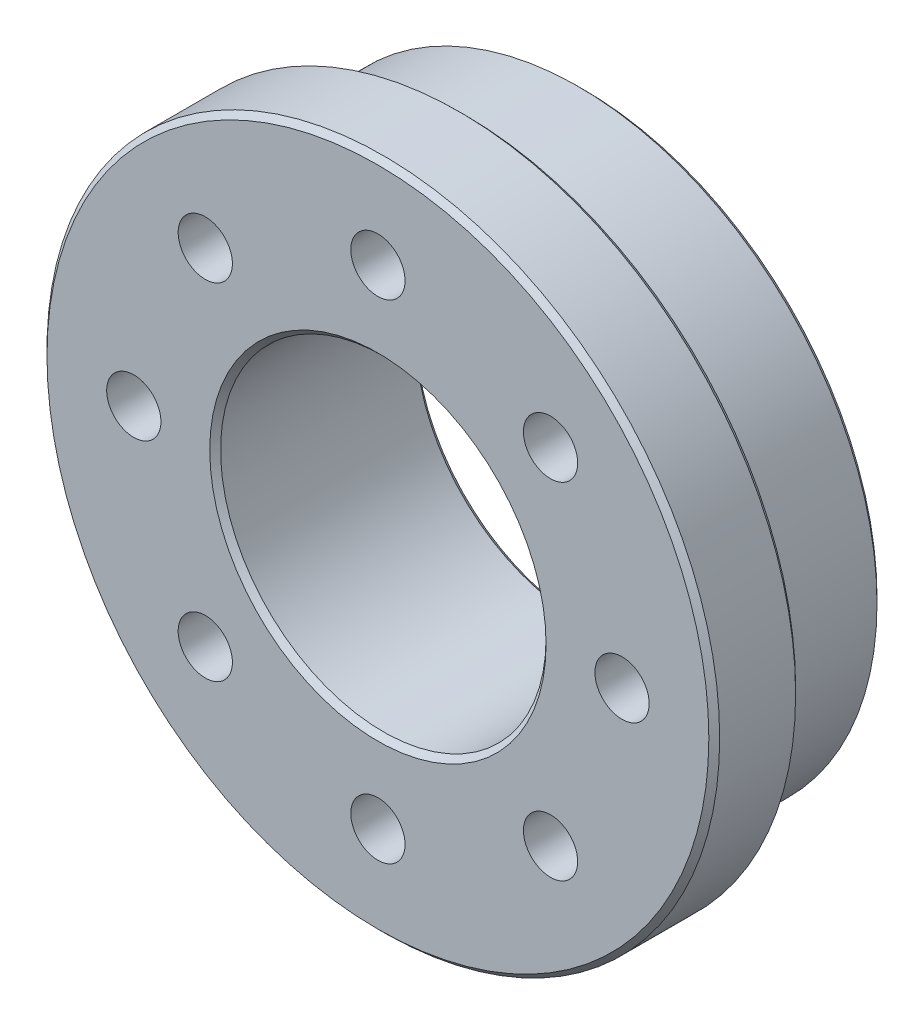
ISO-10303-21;
HEADER;
FILE_DESCRIPTION(('STEP AP214'),'2;1');
FILE_NAME('part.step','',(''),(''),'','','');
FILE_SCHEMA(('AUTOMOTIVE_DESIGN { 1 0 10303 214 1 1 1 1 }'));
ENDSEC;
DATA;
#1=APPLICATION_CONTEXT('core data for automotive mechanical design processes');
#2=APPLICATION_PROTOCOL_DEFINITION('international standard','automotive_design',2000,#1);
#3=PRODUCT_CONTEXT('',#1,'mechanical');
#4=PRODUCT('Part','Part','',(#3));
#5=PRODUCT_RELATED_PRODUCT_CATEGORY('part','',(#4));
#6=PRODUCT_DEFINITION_FORMATION('','',#4);
#7=PRODUCT_DEFINITION_CONTEXT('part definition',#1,'design');
#8=PRODUCT_DEFINITION('design','',#6,#7);
#9=PRODUCT_DEFINITION_SHAPE('','',#8);
#10=(LENGTH_UNIT() NAMED_UNIT(*) SI_UNIT(.MILLI.,.METRE.));
#11=(NAMED_UNIT(*) PLANE_ANGLE_UNIT() SI_UNIT($,.RADIAN.));
#12=(NAMED_UNIT(*) SI_UNIT($,.STERADIAN.) SOLID_ANGLE_UNIT());
#13=UNCERTAINTY_MEASURE_WITH_UNIT(LENGTH_MEASURE(1.E-05),#10,'distance_accuracy_value','');
#14=(GEOMETRIC_REPRESENTATION_CONTEXT(3) GLOBAL_UNCERTAINTY_ASSIGNED_CONTEXT((#13)) GLOBAL_UNIT_ASSIGNED_CONTEXT((#10,
#11,#12)) REPRESENTATION_CONTEXT('',''));
#15=CARTESIAN_POINT('',(0.,0.,0.));
#16=DIRECTION('',(0.,0.,1.));
#17=DIRECTION('',(1.,0.,0.));
#18=AXIS2_PLACEMENT_3D('',#15,#16,#17);
#19=CARTESIAN_POINT('',(0.,0.,11.));
#20=DIRECTION('',(0.,0.,-1.));
#21=DIRECTION('',(-1.,0.,0.));
#22=AXIS2_PLACEMENT_3D('',#19,#20,#21);
#23=CYLINDRICAL_SURFACE('',#22,27.5);
#24=CARTESIAN_POINT('',(0.,0.,0.500000000000004));
#25=DIRECTION('',(0.,0.,1.));
#26=DIRECTION('',(1.,0.,0.));
#27=AXIS2_PLACEMENT_3D('',#24,#25,#26);
#28=CIRCLE('',#27,27.5);
#29=CARTESIAN_POINT('',(27.5,0.,0.500000000000004));
#30=VERTEX_POINT('',#29);
#31=EDGE_CURVE('E39',#30,#30,#28,.T.);
#32=ORIENTED_EDGE('',*,*,#31,.T.);
#33=EDGE_LOOP('',(#32));
#34=FACE_BOUND('',#33,.T.);
#35=CARTESIAN_POINT('',(0.,0.,11.));
#36=DIRECTION('',(0.,0.,1.));
#37=DIRECTION('',(1.,0.,0.));
#38=AXIS2_PLACEMENT_3D('',#35,#36,#37);
#39=CIRCLE('',#38,27.5);
#40=CARTESIAN_POINT('',(27.5,0.,11.));
#41=VERTEX_POINT('',#40);
#42=EDGE_CURVE('E66',#41,#41,#39,.T.);
#43=ORIENTED_EDGE('',*,*,#42,.F.);
#44=EDGE_LOOP('',(#43));
#45=FACE_BOUND('',#44,.T.);
#46=ADVANCED_FACE('F28',(#34,#45),#23,.T.);
#47=CARTESIAN_POINT('',(0.,0.,0.));
#48=DIRECTION('',(0.,0.,1.));
#49=DIRECTION('',(1.,0.,0.));
#50=AXIS2_PLACEMENT_3D('',#47,#48,#49);
#51=PLANE('',#50);
#52=CARTESIAN_POINT('',(0.,0.,0.));
#53=DIRECTION('',(0.,0.,1.));
#54=DIRECTION('',(1.,0.,0.));
#55=AXIS2_PLACEMENT_3D('',#52,#53,#54);
#56=CIRCLE('',#55,15.5);
#57=CARTESIAN_POINT('',(15.5,0.,0.));
#58=VERTEX_POINT('',#57);
#59=EDGE_CURVE('E48',#58,#58,#56,.T.);
#60=ORIENTED_EDGE('',*,*,#59,.T.);
#61=EDGE_LOOP('',(#60));
#62=FACE_BOUND('',#61,.T.);
#63=CARTESIAN_POINT('',(0.,0.,0.));
#64=DIRECTION('',(0.,0.,1.));
#65=DIRECTION('',(1.,0.,0.));
#66=AXIS2_PLACEMENT_3D('',#63,#64,#65);
#67=CIRCLE('',#66,27.);
#68=CARTESIAN_POINT('',(27.,0.,0.));
#69=VERTEX_POINT('',#68);
#70=EDGE_CURVE('E51',#69,#69,#67,.F.);
#71=ORIENTED_EDGE('',*,*,#70,.T.);
#72=EDGE_LOOP('',(#71));
#73=FACE_BOUND('',#72,.T.);
#74=ADVANCED_FACE('F159',(#62,#73),#51,.F.);
#75=CARTESIAN_POINT('',(0.,0.,11.));
#76=DIRECTION('',(0.,0.,1.));
#77=DIRECTION('',(1.,0.,0.));
#78=AXIS2_PLACEMENT_3D('',#75,#76,#77);
#79=PLANE('',#78);
#80=CARTESIAN_POINT('',(0.,0.,11.));
#81=DIRECTION('',(0.,0.,1.));
#82=DIRECTION('',(1.,0.,0.));
#83=AXIS2_PLACEMENT_3D('',#80,#81,#82);
#84=CIRCLE('',#83,30.5);
#85=CARTESIAN_POINT('',(30.5,0.,11.));
#86=VERTEX_POINT('',#85);
#87=EDGE_CURVE('E54',#86,#86,#84,.F.);
#88=ORIENTED_EDGE('',*,*,#87,.T.);
#89=EDGE_LOOP('',(#88));
#90=FACE_BOUND('',#89,.T.);
#91=ORIENTED_EDGE('',*,*,#42,.T.);
#92=EDGE_LOOP('',(#91));
#93=FACE_BOUND('',#92,.T.);
#94=ADVANCED_FACE('F165',(#90,#93),#79,.F.);
#95=CARTESIAN_POINT('',(0.,0.,19.));
#96=DIRECTION('',(0.,0.,-1.));
#97=DIRECTION('',(-1.,0.,0.));
#98=AXIS2_PLACEMENT_3D('',#95,#96,#97);
#99=CYLINDRICAL_SURFACE('',#98,31.);
#100=CARTESIAN_POINT('',(0.,0.,18.5));
#101=DIRECTION('',(0.,0.,1.));
#102=DIRECTION('',(1.,0.,0.));
#103=AXIS2_PLACEMENT_3D('',#100,#101,#102);
#104=CIRCLE('',#103,31.);
#105=CARTESIAN_POINT('',(31.,0.,18.5));
#106=VERTEX_POINT('',#105);
#107=EDGE_CURVE('E57',#106,#106,#104,.F.);
#108=ORIENTED_EDGE('',*,*,#107,.T.);
#109=EDGE_LOOP('',(#108));
#110=FACE_BOUND('',#109,.T.);
#111=CARTESIAN_POINT('',(0.,0.,11.5));
#112=DIRECTION('',(0.,0.,1.));
#113=DIRECTION('',(1.,0.,0.));
#114=AXIS2_PLACEMENT_3D('',#111,#112,#113);
#115=CIRCLE('',#114,31.);
#116=CARTESIAN_POINT('',(31.,0.,11.5));
#117=VERTEX_POINT('',#116);
#118=EDGE_CURVE('E60',#117,#117,#115,.T.);
#119=ORIENTED_EDGE('',*,*,#118,.T.);
#120=EDGE_LOOP('',(#119));
#121=FACE_BOUND('',#120,.T.);
#122=ADVANCED_FACE('F131',(#110,#121),#99,.T.);
#123=CARTESIAN_POINT('',(0.,0.,19.));
#124=DIRECTION('',(0.,0.,1.));
#125=DIRECTION('',(1.,0.,0.));
#126=AXIS2_PLACEMENT_3D('',#123,#124,#125);
#127=PLANE('',#126);
#128=CARTESIAN_POINT('',(0.,0.,19.));
#129=DIRECTION('',(0.,0.,1.));
#130=DIRECTION('',(1.,0.,0.));
#131=AXIS2_PLACEMENT_3D('',#128,#129,#130);
#132=CIRCLE('',#131,15.5);
#133=CARTESIAN_POINT('',(15.5,0.,19.));
#134=VERTEX_POINT('',#133);
#135=EDGE_CURVE('E10',#134,#134,#132,.F.);
#136=ORIENTED_EDGE('',*,*,#135,.T.);
#137=EDGE_LOOP('',(#136));
#138=FACE_BOUND('',#137,.T.);
#139=CARTESIAN_POINT('',(0.,0.,19.));
#140=DIRECTION('',(0.,0.,1.));
#141=DIRECTION('',(1.,0.,0.));
#142=AXIS2_PLACEMENT_3D('',#139,#140,#141);
#143=CIRCLE('',#142,30.5);
#144=CARTESIAN_POINT('',(30.5,0.,19.));
#145=VERTEX_POINT('',#144);
#146=EDGE_CURVE('E63',#145,#145,#143,.T.);
#147=ORIENTED_EDGE('',*,*,#146,.T.);
#148=EDGE_LOOP('',(#147));
#149=FACE_BOUND('',#148,.T.);
#150=CARTESIAN_POINT('',(-15.9099025766972,15.9099025766971,19.));
#151=DIRECTION('',(0.,0.,1.));
#152=DIRECTION('',(1.,0.,0.));
#153=AXIS2_PLACEMENT_3D('',#150,#151,#152);
#154=CIRCLE('',#153,2.50000000000056);
#155=CARTESIAN_POINT('',(-13.4099025766967,15.9099025766971,19.));
#156=VERTEX_POINT('',#155);
#157=EDGE_CURVE('E112',#156,#156,#154,.T.);
#158=ORIENTED_EDGE('',*,*,#157,.F.);
#159=EDGE_LOOP('',(#158));
#160=FACE_BOUND('',#159,.T.);
#161=CARTESIAN_POINT('',(-22.4999999999997,-2.96889500051071E-13,19.));
#162=DIRECTION('',(0.,0.,1.));
#163=DIRECTION('',(1.,0.,0.));
#164=AXIS2_PLACEMENT_3D('',#161,#162,#163);
#165=CIRCLE('',#164,2.50000000000056);
#166=CARTESIAN_POINT('',(-19.9999999999992,-2.96889500051071E-13,19.));
#167=VERTEX_POINT('',#166);
#168=EDGE_CURVE('E106',#167,#167,#165,.T.);
#169=ORIENTED_EDGE('',*,*,#168,.F.);
#170=EDGE_LOOP('',(#169));
#171=FACE_BOUND('',#170,.T.);
#172=CARTESIAN_POINT('',(-15.9099025766968,-15.9099025766975,19.));
#173=DIRECTION('',(0.,0.,1.));
#174=DIRECTION('',(1.,0.,0.));
#175=AXIS2_PLACEMENT_3D('',#172,#173,#174);
#176=CIRCLE('',#175,2.50000000000056);
#177=CARTESIAN_POINT('',(-13.4099025766963,-15.9099025766975,19.));
#178=VERTEX_POINT('',#177);
#179=EDGE_CURVE('E100',#178,#178,#176,.T.);
#180=ORIENTED_EDGE('',*,*,#179,.F.);
#181=EDGE_LOOP('',(#180));
#182=FACE_BOUND('',#181,.T.);
#183=CARTESIAN_POINT('',(5.71144402693228E-13,-22.5,19.));
#184=DIRECTION('',(0.,0.,1.));
#185=DIRECTION('',(1.,0.,0.));
#186=AXIS2_PLACEMENT_3D('',#183,#184,#185);
#187=CIRCLE('',#186,2.50000000000056);
#188=CARTESIAN_POINT('',(2.50000000000113,-22.5,19.));
#189=VERTEX_POINT('',#188);
#190=EDGE_CURVE('E94',#189,#189,#187,.T.);
#191=ORIENTED_EDGE('',*,*,#190,.F.);
#192=EDGE_LOOP('',(#191));
#193=FACE_BOUND('',#192,.T.);
#194=CARTESIAN_POINT('',(15.9099025766978,-15.9099025766971,19.));
#195=DIRECTION('',(0.,0.,1.));
#196=DIRECTION('',(1.,0.,0.));
#197=AXIS2_PLACEMENT_3D('',#194,#195,#196);
#198=CIRCLE('',#197,2.50000000000051);
#199=CARTESIAN_POINT('',(18.4099025766983,-15.9099025766971,19.));
#200=VERTEX_POINT('',#199);
#201=EDGE_CURVE('E88',#200,#200,#198,.T.);
#202=ORIENTED_EDGE('',*,*,#201,.F.);
#203=EDGE_LOOP('',(#202));
#204=FACE_BOUND('',#203,.T.);
#205=CARTESIAN_POINT('',(22.5000000000003,2.86405073463184E-13,19.));
#206=DIRECTION('',(0.,0.,1.));
#207=DIRECTION('',(1.,0.,0.));
#208=AXIS2_PLACEMENT_3D('',#205,#206,#207);
#209=CIRCLE('',#208,2.50000000000056);
#210=CARTESIAN_POINT('',(25.0000000000008,2.86405073463184E-13,19.));
#211=VERTEX_POINT('',#210);
#212=EDGE_CURVE('E82',#211,#211,#209,.T.);
#213=ORIENTED_EDGE('',*,*,#212,.F.);
#214=EDGE_LOOP('',(#213));
#215=FACE_BOUND('',#214,.T.);
#216=CARTESIAN_POINT('',(15.9099025766974,15.9099025766975,19.));
#217=DIRECTION('',(0.,0.,1.));
#218=DIRECTION('',(1.,0.,0.));
#219=AXIS2_PLACEMENT_3D('',#216,#217,#218);
#220=CIRCLE('',#219,2.50000000000056);
#221=CARTESIAN_POINT('',(18.409902576698,15.9099025766975,19.));
#222=VERTEX_POINT('',#221);
#223=EDGE_CURVE('E76',#222,#222,#220,.T.);
#224=ORIENTED_EDGE('',*,*,#223,.F.);
#225=EDGE_LOOP('',(#224));
#226=FACE_BOUND('',#225,.T.);
#227=CARTESIAN_POINT('',(0.,22.5,19.));
#228=DIRECTION('',(0.,0.,1.));
#229=DIRECTION('',(1.,0.,0.));
#230=AXIS2_PLACEMENT_3D('',#227,#228,#229);
#231=CIRCLE('',#230,2.50000000000056);
#232=CARTESIAN_POINT('',(2.50000000000056,22.5,19.));
#233=VERTEX_POINT('',#232);
#234=EDGE_CURVE('E70',#233,#233,#231,.T.);
#235=ORIENTED_EDGE('',*,*,#234,.F.);
#236=EDGE_LOOP('',(#235));
#237=FACE_BOUND('',#236,.T.);
#238=ADVANCED_FACE('F127',(#138,#149,#160,#171,#182,#193,#204,#215,#226,#237),#127,.T.);
#239=CARTESIAN_POINT('',(0.,22.5,4.));
#240=DIRECTION('',(0.,0.,1.));
#241=DIRECTION('',(1.,0.,0.));
#242=AXIS2_PLACEMENT_3D('',#239,#240,#241);
#243=CYLINDRICAL_SURFACE('',#242,2.50000000000056);
#244=CARTESIAN_POINT('',(0.,22.5,4.));
#245=DIRECTION('',(0.,0.,1.));
#246=DIRECTION('',(1.,0.,0.));
#247=AXIS2_PLACEMENT_3D('',#244,#245,#246);
#248=CIRCLE('',#247,2.50000000000056);
#249=CARTESIAN_POINT('',(2.50000000000056,22.5,4.));
#250=VERTEX_POINT('',#249);
#251=EDGE_CURVE('E69',#250,#250,#248,.T.);
#252=ORIENTED_EDGE('',*,*,#251,.F.);
#253=EDGE_LOOP('',(#252));
#254=FACE_BOUND('',#253,.T.);
#255=ORIENTED_EDGE('',*,*,#234,.T.);
#256=EDGE_LOOP('',(#255));
#257=FACE_BOUND('',#256,.T.);
#258=ADVANCED_FACE('F130',(#254,#257),#243,.F.);
#259=CARTESIAN_POINT('',(0.,22.5,4.));
#260=DIRECTION('',(0.,0.,1.));
#261=DIRECTION('',(1.,0.,0.));
#262=AXIS2_PLACEMENT_3D('',#259,#260,#261);
#263=PLANE('',#262);
#264=ORIENTED_EDGE('',*,*,#251,.T.);
#265=EDGE_LOOP('',(#264));
#266=FACE_BOUND('',#265,.T.);
#267=ADVANCED_FACE('F148',(#266),#263,.T.);
#268=CARTESIAN_POINT('',(15.9099025766974,15.9099025766975,4.));
#269=DIRECTION('',(0.,0.,1.));
#270=DIRECTION('',(1.,0.,0.));
#271=AXIS2_PLACEMENT_3D('',#268,#269,#270);
#272=CYLINDRICAL_SURFACE('',#271,2.50000000000056);
#273=CARTESIAN_POINT('',(15.9099025766974,15.9099025766975,4.));
#274=DIRECTION('',(0.,0.,1.));
#275=DIRECTION('',(1.,0.,0.));
#276=AXIS2_PLACEMENT_3D('',#273,#274,#275);
#277=CIRCLE('',#276,2.50000000000056);
#278=CARTESIAN_POINT('',(18.409902576698,15.9099025766975,4.));
#279=VERTEX_POINT('',#278);
#280=EDGE_CURVE('E73',#279,#279,#277,.T.);
#281=ORIENTED_EDGE('',*,*,#280,.F.);
#282=EDGE_LOOP('',(#281));
#283=FACE_BOUND('',#282,.T.);
#284=ORIENTED_EDGE('',*,*,#223,.T.);
#285=EDGE_LOOP('',(#284));
#286=FACE_BOUND('',#285,.T.);
#287=ADVANCED_FACE('F154',(#283,#286),#272,.F.);
#288=CARTESIAN_POINT('',(15.9099025766974,15.9099025766975,4.));
#289=DIRECTION('',(0.,0.,1.));
#290=DIRECTION('',(1.,0.,0.));
#291=AXIS2_PLACEMENT_3D('',#288,#289,#290);
#292=PLANE('',#291);
#293=ORIENTED_EDGE('',*,*,#280,.T.);
#294=EDGE_LOOP('',(#293));
#295=FACE_BOUND('',#294,.T.);
#296=ADVANCED_FACE('F374',(#295),#292,.T.);
#297=CARTESIAN_POINT('',(22.5000000000003,2.86405073463184E-13,4.));
#298=DIRECTION('',(0.,0.,1.));
#299=DIRECTION('',(1.,0.,0.));
#300=AXIS2_PLACEMENT_3D('',#297,#298,#299);
#301=CYLINDRICAL_SURFACE('',#300,2.50000000000056);
#302=CARTESIAN_POINT('',(22.5000000000003,2.86405073463184E-13,4.));
#303=DIRECTION('',(0.,0.,1.));
#304=DIRECTION('',(1.,0.,0.));
#305=AXIS2_PLACEMENT_3D('',#302,#303,#304);
#306=CIRCLE('',#305,2.50000000000056);
#307=CARTESIAN_POINT('',(25.0000000000008,2.86405073463184E-13,4.));
#308=VERTEX_POINT('',#307);
#309=EDGE_CURVE('E79',#308,#308,#306,.T.);
#310=ORIENTED_EDGE('',*,*,#309,.F.);
#311=EDGE_LOOP('',(#310));
#312=FACE_BOUND('',#311,.T.);
#313=ORIENTED_EDGE('',*,*,#212,.T.);
#314=EDGE_LOOP('',(#313));
#315=FACE_BOUND('',#314,.T.);
#316=ADVANCED_FACE('F364',(#312,#315),#301,.F.);
#317=CARTESIAN_POINT('',(22.5000000000003,2.86405073463184E-13,4.));
#318=DIRECTION('',(0.,0.,1.));
#319=DIRECTION('',(1.,0.,0.));
#320=AXIS2_PLACEMENT_3D('',#317,#318,#319);
#321=PLANE('',#320);
#322=ORIENTED_EDGE('',*,*,#309,.T.);
#323=EDGE_LOOP('',(#322));
#324=FACE_BOUND('',#323,.T.);
#325=ADVANCED_FACE('F354',(#324),#321,.T.);
#326=CARTESIAN_POINT('',(15.9099025766978,-15.9099025766971,4.));
#327=DIRECTION('',(0.,0.,1.));
#328=DIRECTION('',(1.,0.,0.));
#329=AXIS2_PLACEMENT_3D('',#326,#327,#328);
#330=CYLINDRICAL_SURFACE('',#329,2.50000000000051);
#331=CARTESIAN_POINT('',(15.9099025766978,-15.9099025766971,4.));
#332=DIRECTION('',(0.,0.,1.));
#333=DIRECTION('',(1.,0.,0.));
#334=AXIS2_PLACEMENT_3D('',#331,#332,#333);
#335=CIRCLE('',#334,2.50000000000051);
#336=CARTESIAN_POINT('',(18.4099025766983,-15.9099025766971,4.));
#337=VERTEX_POINT('',#336);
#338=EDGE_CURVE('E85',#337,#337,#335,.T.);
#339=ORIENTED_EDGE('',*,*,#338,.F.);
#340=EDGE_LOOP('',(#339));
#341=FACE_BOUND('',#340,.T.);
#342=ORIENTED_EDGE('',*,*,#201,.T.);
#343=EDGE_LOOP('',(#342));
#344=FACE_BOUND('',#343,.T.);
#345=ADVANCED_FACE('F344',(#341,#344),#330,.F.);
#346=CARTESIAN_POINT('',(15.9099025766978,-15.9099025766971,4.));
#347=DIRECTION('',(0.,0.,1.));
#348=DIRECTION('',(1.,0.,0.));
#349=AXIS2_PLACEMENT_3D('',#346,#347,#348);
#350=PLANE('',#349);
#351=ORIENTED_EDGE('',*,*,#338,.T.);
#352=EDGE_LOOP('',(#351));
#353=FACE_BOUND('',#352,.T.);
#354=ADVANCED_FACE('F334',(#353),#350,.T.);
#355=CARTESIAN_POINT('',(5.71144402693228E-13,-22.5,4.));
#356=DIRECTION('',(0.,0.,1.));
#357=DIRECTION('',(1.,0.,0.));
#358=AXIS2_PLACEMENT_3D('',#355,#356,#357);
#359=CYLINDRICAL_SURFACE('',#358,2.50000000000056);
#360=CARTESIAN_POINT('',(5.71144402693228E-13,-22.5,4.));
#361=DIRECTION('',(0.,0.,1.));
#362=DIRECTION('',(1.,0.,0.));
#363=AXIS2_PLACEMENT_3D('',#360,#361,#362);
#364=CIRCLE('',#363,2.50000000000056);
#365=CARTESIAN_POINT('',(2.50000000000113,-22.5,4.));
#366=VERTEX_POINT('',#365);
#367=EDGE_CURVE('E91',#366,#366,#364,.T.);
#368=ORIENTED_EDGE('',*,*,#367,.F.);
#369=EDGE_LOOP('',(#368));
#370=FACE_BOUND('',#369,.T.);
#371=ORIENTED_EDGE('',*,*,#190,.T.);
#372=EDGE_LOOP('',(#371));
#373=FACE_BOUND('',#372,.T.);
#374=ADVANCED_FACE('F324',(#370,#373),#359,.F.);
#375=CARTESIAN_POINT('',(5.71144402693228E-13,-22.5,4.));
#376=DIRECTION('',(0.,0.,1.));
#377=DIRECTION('',(1.,0.,0.));
#378=AXIS2_PLACEMENT_3D('',#375,#376,#377);
#379=PLANE('',#378);
#380=ORIENTED_EDGE('',*,*,#367,.T.);
#381=EDGE_LOOP('',(#380));
#382=FACE_BOUND('',#381,.T.);
#383=ADVANCED_FACE('F314',(#382),#379,.T.);
#384=CARTESIAN_POINT('',(-15.9099025766968,-15.9099025766975,4.));
#385=DIRECTION('',(0.,0.,1.));
#386=DIRECTION('',(1.,0.,0.));
#387=AXIS2_PLACEMENT_3D('',#384,#385,#386);
#388=CYLINDRICAL_SURFACE('',#387,2.50000000000056);
#389=CARTESIAN_POINT('',(-15.9099025766968,-15.9099025766975,4.));
#390=DIRECTION('',(0.,0.,1.));
#391=DIRECTION('',(1.,0.,0.));
#392=AXIS2_PLACEMENT_3D('',#389,#390,#391);
#393=CIRCLE('',#392,2.50000000000056);
#394=CARTESIAN_POINT('',(-13.4099025766963,-15.9099025766975,4.));
#395=VERTEX_POINT('',#394);
#396=EDGE_CURVE('E97',#395,#395,#393,.T.);
#397=ORIENTED_EDGE('',*,*,#396,.F.);
#398=EDGE_LOOP('',(#397));
#399=FACE_BOUND('',#398,.T.);
#400=ORIENTED_EDGE('',*,*,#179,.T.);
#401=EDGE_LOOP('',(#400));
#402=FACE_BOUND('',#401,.T.);
#403=ADVANCED_FACE('F304',(#399,#402),#388,.F.);
#404=CARTESIAN_POINT('',(-15.9099025766968,-15.9099025766975,4.));
#405=DIRECTION('',(0.,0.,1.));
#406=DIRECTION('',(1.,0.,0.));
#407=AXIS2_PLACEMENT_3D('',#404,#405,#406);
#408=PLANE('',#407);
#409=ORIENTED_EDGE('',*,*,#396,.T.);
#410=EDGE_LOOP('',(#409));
#411=FACE_BOUND('',#410,.T.);
#412=ADVANCED_FACE('F294',(#411),#408,.T.);
#413=CARTESIAN_POINT('',(-22.4999999999997,-2.96889500051071E-13,4.));
#414=DIRECTION('',(0.,0.,1.));
#415=DIRECTION('',(1.,0.,0.));
#416=AXIS2_PLACEMENT_3D('',#413,#414,#415);
#417=CYLINDRICAL_SURFACE('',#416,2.50000000000056);
#418=CARTESIAN_POINT('',(-22.4999999999997,-2.96889500051071E-13,4.));
#419=DIRECTION('',(0.,0.,1.));
#420=DIRECTION('',(1.,0.,0.));
#421=AXIS2_PLACEMENT_3D('',#418,#419,#420);
#422=CIRCLE('',#421,2.50000000000056);
#423=CARTESIAN_POINT('',(-19.9999999999992,-2.96889500051071E-13,4.));
#424=VERTEX_POINT('',#423);
#425=EDGE_CURVE('E103',#424,#424,#422,.T.);
#426=ORIENTED_EDGE('',*,*,#425,.F.);
#427=EDGE_LOOP('',(#426));
#428=FACE_BOUND('',#427,.T.);
#429=ORIENTED_EDGE('',*,*,#168,.T.);
#430=EDGE_LOOP('',(#429));
#431=FACE_BOUND('',#430,.T.);
#432=ADVANCED_FACE('F284',(#428,#431),#417,.F.);
#433=CARTESIAN_POINT('',(-22.4999999999997,-2.96889500051071E-13,4.));
#434=DIRECTION('',(0.,0.,1.));
#435=DIRECTION('',(1.,0.,0.));
#436=AXIS2_PLACEMENT_3D('',#433,#434,#435);
#437=PLANE('',#436);
#438=ORIENTED_EDGE('',*,*,#425,.T.);
#439=EDGE_LOOP('',(#438));
#440=FACE_BOUND('',#439,.T.);
#441=ADVANCED_FACE('F123',(#440),#437,.T.);
#442=CARTESIAN_POINT('',(-15.9099025766972,15.9099025766971,4.));
#443=DIRECTION('',(0.,0.,1.));
#444=DIRECTION('',(1.,0.,0.));
#445=AXIS2_PLACEMENT_3D('',#442,#443,#444);
#446=CYLINDRICAL_SURFACE('',#445,2.50000000000056);
#447=CARTESIAN_POINT('',(-15.9099025766972,15.9099025766971,4.));
#448=DIRECTION('',(0.,0.,1.));
#449=DIRECTION('',(1.,0.,0.));
#450=AXIS2_PLACEMENT_3D('',#447,#448,#449);
#451=CIRCLE('',#450,2.50000000000056);
#452=CARTESIAN_POINT('',(-13.4099025766967,15.9099025766971,4.));
#453=VERTEX_POINT('',#452);
#454=EDGE_CURVE('E109',#453,#453,#451,.T.);
#455=ORIENTED_EDGE('',*,*,#454,.F.);
#456=EDGE_LOOP('',(#455));
#457=FACE_BOUND('',#456,.T.);
#458=ORIENTED_EDGE('',*,*,#157,.T.);
#459=EDGE_LOOP('',(#458));
#460=FACE_BOUND('',#459,.T.);
#461=ADVANCED_FACE('F120',(#457,#460),#446,.F.);
#462=CARTESIAN_POINT('',(-15.9099025766972,15.9099025766971,4.));
#463=DIRECTION('',(0.,0.,1.));
#464=DIRECTION('',(1.,0.,0.));
#465=AXIS2_PLACEMENT_3D('',#462,#463,#464);
#466=PLANE('',#465);
#467=ORIENTED_EDGE('',*,*,#454,.T.);
#468=EDGE_LOOP('',(#467));
#469=FACE_BOUND('',#468,.T.);
#470=ADVANCED_FACE('F118',(#469),#466,.T.);
#471=CARTESIAN_POINT('',(0.,0.,0.));
#472=DIRECTION('',(0.,0.,1.));
#473=DIRECTION('',(1.,0.,0.));
#474=AXIS2_PLACEMENT_3D('',#471,#472,#473);
#475=CYLINDRICAL_SURFACE('',#474,15.);
#476=CARTESIAN_POINT('',(0.,0.,18.5));
#477=DIRECTION('',(0.,0.,1.));
#478=DIRECTION('',(1.,0.,0.));
#479=AXIS2_PLACEMENT_3D('',#476,#477,#478);
#480=CIRCLE('',#479,15.);
#481=CARTESIAN_POINT('',(15.,0.,18.5));
#482=VERTEX_POINT('',#481);
#483=EDGE_CURVE('E35',#482,#482,#480,.T.);
#484=ORIENTED_EDGE('',*,*,#483,.T.);
#485=EDGE_LOOP('',(#484));
#486=FACE_BOUND('',#485,.T.);
#487=CARTESIAN_POINT('',(0.,0.,0.499999999999999));
#488=DIRECTION('',(0.,0.,1.));
#489=DIRECTION('',(1.,0.,0.));
#490=AXIS2_PLACEMENT_3D('',#487,#488,#489);
#491=CIRCLE('',#490,15.);
#492=CARTESIAN_POINT('',(15.,0.,0.499999999999999));
#493=VERTEX_POINT('',#492);
#494=EDGE_CURVE('E43',#493,#493,#491,.F.);
#495=ORIENTED_EDGE('',*,*,#494,.T.);
#496=EDGE_LOOP('',(#495));
#497=FACE_BOUND('',#496,.T.);
#498=ADVANCED_FACE('F175',(#486,#497),#475,.F.);
#499=CARTESIAN_POINT('',(0.,0.,19.));
#500=DIRECTION('',(0.,0.,-1.));
#501=DIRECTION('',(-1.,0.,0.));
#502=AXIS2_PLACEMENT_3D('',#499,#500,#501);
#503=CONICAL_SURFACE('',#502,30.5,0.785398163397452);
#504=ORIENTED_EDGE('',*,*,#107,.F.);
#505=EDGE_LOOP('',(#504));
#506=FACE_BOUND('',#505,.T.);
#507=ORIENTED_EDGE('',*,*,#146,.F.);
#508=EDGE_LOOP('',(#507));
#509=FACE_BOUND('',#508,.T.);
#510=ADVANCED_FACE('F171',(#506,#509),#503,.T.);
#511=CARTESIAN_POINT('',(0.,0.,11.5));
#512=DIRECTION('',(0.,0.,1.));
#513=DIRECTION('',(1.,0.,0.));
#514=AXIS2_PLACEMENT_3D('',#511,#512,#513);
#515=CONICAL_SURFACE('',#514,31.,0.785398163397452);
#516=ORIENTED_EDGE('',*,*,#87,.F.);
#517=EDGE_LOOP('',(#516));
#518=FACE_BOUND('',#517,.T.);
#519=ORIENTED_EDGE('',*,*,#118,.F.);
#520=EDGE_LOOP('',(#519));
#521=FACE_BOUND('',#520,.T.);
#522=ADVANCED_FACE('F174',(#518,#521),#515,.T.);
#523=CARTESIAN_POINT('',(0.,0.,0.));
#524=DIRECTION('',(0.,0.,-1.));
#525=DIRECTION('',(-1.,0.,0.));
#526=AXIS2_PLACEMENT_3D('',#523,#524,#525);
#527=CONICAL_SURFACE('',#526,15.5,0.785398163397448);
#528=ORIENTED_EDGE('',*,*,#494,.F.);
#529=EDGE_LOOP('',(#528));
#530=FACE_BOUND('',#529,.T.);
#531=ORIENTED_EDGE('',*,*,#59,.F.);
#532=EDGE_LOOP('',(#531));
#533=FACE_BOUND('',#532,.T.);
#534=ADVANCED_FACE('F179',(#530,#533),#527,.F.);
#535=CARTESIAN_POINT('',(0.,0.,0.500000000000004));
#536=DIRECTION('',(0.,0.,1.));
#537=DIRECTION('',(1.,0.,0.));
#538=AXIS2_PLACEMENT_3D('',#535,#536,#537);
#539=CONICAL_SURFACE('',#538,27.5,0.785398163397448);
#540=ORIENTED_EDGE('',*,*,#70,.F.);
#541=EDGE_LOOP('',(#540));
#542=FACE_BOUND('',#541,.T.);
#543=ORIENTED_EDGE('',*,*,#31,.F.);
#544=EDGE_LOOP('',(#543));
#545=FACE_BOUND('',#544,.T.);
#546=ADVANCED_FACE('F182',(#542,#545),#539,.T.);
#547=CARTESIAN_POINT('',(0.,0.,18.5));
#548=DIRECTION('',(0.,0.,1.));
#549=DIRECTION('',(1.,0.,0.));
#550=AXIS2_PLACEMENT_3D('',#547,#548,#549);
#551=CONICAL_SURFACE('',#550,15.,0.785398163397448);
#552=ORIENTED_EDGE('',*,*,#135,.F.);
#553=EDGE_LOOP('',(#552));
#554=FACE_BOUND('',#553,.T.);
#555=ORIENTED_EDGE('',*,*,#483,.F.);
#556=EDGE_LOOP('',(#555));
#557=FACE_BOUND('',#556,.T.);
#558=ADVANCED_FACE('F30',(#554,#557),#551,.F.);
#559=CLOSED_SHELL('',(#46,#74,#94,#122,#238,#258,#267,#287,#296,#316,#325,#345,#354,#374,#383,
#403,#412,#432,#441,#461,#470,#498,#510,#522,#534,#546,#558));
#560=MANIFOLD_SOLID_BREP('B2',#559);
#561=ADVANCED_BREP_SHAPE_REPRESENTATION('',(#18,#560),#14);
#562=SHAPE_DEFINITION_REPRESENTATION(#9,#561);
ENDSEC;
END-ISO-10303-21;
